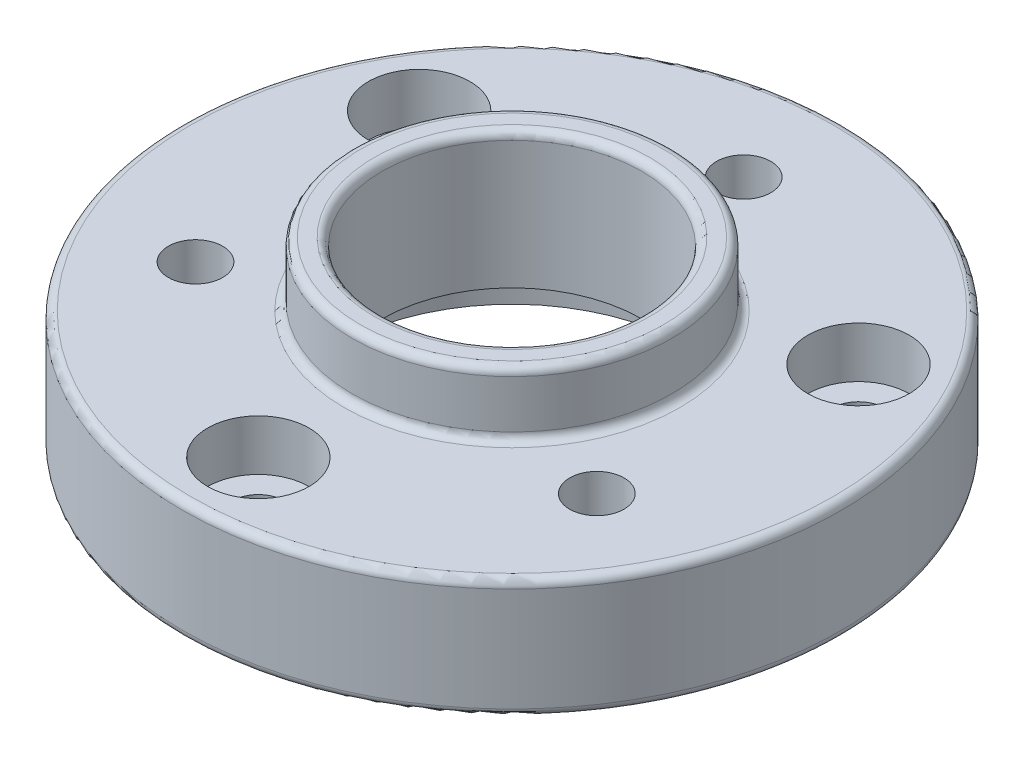
ISO-10303-21;
HEADER;
FILE_DESCRIPTION(('STEP AP214'),'2;1');
FILE_NAME('part.step','',(''),(''),'','','');
FILE_SCHEMA(('AUTOMOTIVE_DESIGN { 1 0 10303 214 1 1 1 1 }'));
ENDSEC;
DATA;
#1=APPLICATION_CONTEXT('core data for automotive mechanical design processes');
#2=APPLICATION_PROTOCOL_DEFINITION('international standard','automotive_design',2000,#1);
#3=PRODUCT_CONTEXT('',#1,'mechanical');
#4=PRODUCT('Part','Part','',(#3));
#5=PRODUCT_RELATED_PRODUCT_CATEGORY('part','',(#4));
#6=PRODUCT_DEFINITION_FORMATION('','',#4);
#7=PRODUCT_DEFINITION_CONTEXT('part definition',#1,'design');
#8=PRODUCT_DEFINITION('design','',#6,#7);
#9=PRODUCT_DEFINITION_SHAPE('','',#8);
#10=(LENGTH_UNIT() NAMED_UNIT(*) SI_UNIT(.MILLI.,.METRE.));
#11=(NAMED_UNIT(*) PLANE_ANGLE_UNIT() SI_UNIT($,.RADIAN.));
#12=(NAMED_UNIT(*) SI_UNIT($,.STERADIAN.) SOLID_ANGLE_UNIT());
#13=UNCERTAINTY_MEASURE_WITH_UNIT(LENGTH_MEASURE(1.E-05),#10,'distance_accuracy_value','');
#14=(GEOMETRIC_REPRESENTATION_CONTEXT(3) GLOBAL_UNCERTAINTY_ASSIGNED_CONTEXT((#13)) GLOBAL_UNIT_ASSIGNED_CONTEXT((#10,
#11,#12)) REPRESENTATION_CONTEXT('',''));
#15=CARTESIAN_POINT('',(0.,0.,0.));
#16=DIRECTION('',(0.,0.,1.));
#17=DIRECTION('',(1.,0.,0.));
#18=AXIS2_PLACEMENT_3D('',#15,#16,#17);
#19=CARTESIAN_POINT('',(0.,23.,0.));
#20=DIRECTION('',(0.,-1.,0.));
#21=DIRECTION('',(0.,0.,-1.));
#22=AXIS2_PLACEMENT_3D('',#19,#20,#21);
#23=CYLINDRICAL_SURFACE('',#22,16.25);
#24=CARTESIAN_POINT('',(0.,22.,0.));
#25=DIRECTION('',(0.,1.,0.));
#26=DIRECTION('',(0.,0.,1.));
#27=AXIS2_PLACEMENT_3D('',#24,#25,#26);
#28=CIRCLE('',#27,16.25);
#29=CARTESIAN_POINT('',(0.,22.,16.25));
#30=VERTEX_POINT('',#29);
#31=EDGE_CURVE('E68',#30,#30,#28,.T.);
#32=ORIENTED_EDGE('',*,*,#31,.T.);
#33=EDGE_LOOP('',(#32));
#34=FACE_BOUND('',#33,.T.);
#35=CARTESIAN_POINT('',(0.,6.,0.));
#36=DIRECTION('',(0.,-1.,0.));
#37=DIRECTION('',(0.,0.,-1.));
#38=AXIS2_PLACEMENT_3D('',#35,#36,#37);
#39=CIRCLE('',#38,16.25);
#40=CARTESIAN_POINT('',(0.,6.,-16.25));
#41=VERTEX_POINT('',#40);
#42=EDGE_CURVE('E92',#41,#41,#39,.T.);
#43=ORIENTED_EDGE('',*,*,#42,.T.);
#44=EDGE_LOOP('',(#43));
#45=FACE_BOUND('',#44,.T.);
#46=ADVANCED_FACE('F45',(#34,#45),#23,.F.);
#47=CARTESIAN_POINT('',(0.,15.,0.));
#48=DIRECTION('',(0.,-1.,0.));
#49=DIRECTION('',(0.,0.,-1.));
#50=AXIS2_PLACEMENT_3D('',#47,#48,#49);
#51=CYLINDRICAL_SURFACE('',#50,41.25);
#52=CARTESIAN_POINT('',(0.,1.,0.));
#53=DIRECTION('',(0.,1.,0.));
#54=DIRECTION('',(0.,0.,1.));
#55=AXIS2_PLACEMENT_3D('',#52,#53,#54);
#56=CIRCLE('',#55,41.25);
#57=CARTESIAN_POINT('',(0.,1.,41.25));
#58=VERTEX_POINT('',#57);
#59=EDGE_CURVE('E52',#58,#58,#56,.T.);
#60=ORIENTED_EDGE('',*,*,#59,.T.);
#61=EDGE_LOOP('',(#60));
#62=FACE_BOUND('',#61,.T.);
#63=CARTESIAN_POINT('',(0.,14.,0.));
#64=DIRECTION('',(0.,1.,0.));
#65=DIRECTION('',(0.,0.,1.));
#66=AXIS2_PLACEMENT_3D('',#63,#64,#65);
#67=CIRCLE('',#66,41.25);
#68=CARTESIAN_POINT('',(0.,14.,41.25));
#69=VERTEX_POINT('',#68);
#70=EDGE_CURVE('E56',#69,#69,#67,.F.);
#71=ORIENTED_EDGE('',*,*,#70,.T.);
#72=EDGE_LOOP('',(#71));
#73=FACE_BOUND('',#72,.T.);
#74=ADVANCED_FACE('F156',(#62,#73),#51,.T.);
#75=CARTESIAN_POINT('',(0.,15.,0.));
#76=DIRECTION('',(0.,1.,0.));
#77=DIRECTION('',(0.,0.,1.));
#78=AXIS2_PLACEMENT_3D('',#75,#76,#77);
#79=PLANE('',#78);
#80=CARTESIAN_POINT('',(0.,15.,-29.));
#81=DIRECTION('',(0.,1.,0.));
#82=DIRECTION('',(0.,0.,1.));
#83=AXIS2_PLACEMENT_3D('',#80,#81,#82);
#84=CIRCLE('',#83,3.39999999999999);
#85=CARTESIAN_POINT('',(0.,15.,-25.6));
#86=VERTEX_POINT('',#85);
#87=EDGE_CURVE('E146',#86,#86,#84,.T.);
#88=ORIENTED_EDGE('',*,*,#87,.F.);
#89=EDGE_LOOP('',(#88));
#90=FACE_BOUND('',#89,.T.);
#91=CARTESIAN_POINT('',(25.1147367097506,15.,14.4999999999989));
#92=DIRECTION('',(0.,1.,0.));
#93=DIRECTION('',(0.,0.,1.));
#94=AXIS2_PLACEMENT_3D('',#91,#92,#93);
#95=CIRCLE('',#94,3.39999999999999);
#96=CARTESIAN_POINT('',(25.1147367097506,15.,17.8999999999989));
#97=VERTEX_POINT('',#96);
#98=EDGE_CURVE('E140',#97,#97,#95,.T.);
#99=ORIENTED_EDGE('',*,*,#98,.F.);
#100=EDGE_LOOP('',(#99));
#101=FACE_BOUND('',#100,.T.);
#102=CARTESIAN_POINT('',(-25.1147367097469,15.,14.5000000000011));
#103=DIRECTION('',(0.,1.,0.));
#104=DIRECTION('',(0.,0.,1.));
#105=AXIS2_PLACEMENT_3D('',#102,#103,#104);
#106=CIRCLE('',#105,3.39999999999999);
#107=CARTESIAN_POINT('',(-25.1147367097469,15.,17.9000000000011));
#108=VERTEX_POINT('',#107);
#109=EDGE_CURVE('E134',#108,#108,#106,.T.);
#110=ORIENTED_EDGE('',*,*,#109,.F.);
#111=EDGE_LOOP('',(#110));
#112=FACE_BOUND('',#111,.T.);
#113=CARTESIAN_POINT('',(0.,15.,0.));
#114=DIRECTION('',(0.,1.,0.));
#115=DIRECTION('',(0.,0.,1.));
#116=AXIS2_PLACEMENT_3D('',#113,#114,#115);
#117=CIRCLE('',#116,21.);
#118=CARTESIAN_POINT('',(0.,15.,21.));
#119=VERTEX_POINT('',#118);
#120=EDGE_CURVE('E71',#119,#119,#117,.F.);
#121=ORIENTED_EDGE('',*,*,#120,.T.);
#122=EDGE_LOOP('',(#121));
#123=FACE_BOUND('',#122,.T.);
#124=CARTESIAN_POINT('',(0.,15.,0.));
#125=DIRECTION('',(0.,1.,0.));
#126=DIRECTION('',(0.,0.,1.));
#127=AXIS2_PLACEMENT_3D('',#124,#125,#126);
#128=CIRCLE('',#127,40.25);
#129=CARTESIAN_POINT('',(0.,15.,40.25));
#130=VERTEX_POINT('',#129);
#131=EDGE_CURVE('E74',#130,#130,#128,.T.);
#132=ORIENTED_EDGE('',*,*,#131,.T.);
#133=EDGE_LOOP('',(#132));
#134=FACE_BOUND('',#133,.T.);
#135=CARTESIAN_POINT('',(0.,15.,31.75));
#136=DIRECTION('',(0.,1.,0.));
#137=DIRECTION('',(0.,0.,1.));
#138=AXIS2_PLACEMENT_3D('',#135,#136,#137);
#139=CIRCLE('',#138,6.35);
#140=CARTESIAN_POINT('',(0.,15.,38.1));
#141=VERTEX_POINT('',#140);
#142=EDGE_CURVE('E128',#141,#141,#139,.T.);
#143=ORIENTED_EDGE('',*,*,#142,.F.);
#144=EDGE_LOOP('',(#143));
#145=FACE_BOUND('',#144,.T.);
#146=CARTESIAN_POINT('',(-27.4963065701559,15.,-15.875));
#147=DIRECTION('',(0.,1.,0.));
#148=DIRECTION('',(0.,0.,1.));
#149=AXIS2_PLACEMENT_3D('',#146,#147,#148);
#150=CIRCLE('',#149,6.35);
#151=CARTESIAN_POINT('',(-27.4963065701559,15.,-9.525));
#152=VERTEX_POINT('',#151);
#153=EDGE_CURVE('E116',#152,#152,#150,.T.);
#154=ORIENTED_EDGE('',*,*,#153,.F.);
#155=EDGE_LOOP('',(#154));
#156=FACE_BOUND('',#155,.T.);
#157=CARTESIAN_POINT('',(27.4963065701559,15.,-15.875));
#158=DIRECTION('',(0.,1.,0.));
#159=DIRECTION('',(0.,0.,1.));
#160=AXIS2_PLACEMENT_3D('',#157,#158,#159);
#161=CIRCLE('',#160,6.35);
#162=CARTESIAN_POINT('',(27.4963065701559,15.,-9.525));
#163=VERTEX_POINT('',#162);
#164=EDGE_CURVE('E104',#163,#163,#161,.T.);
#165=ORIENTED_EDGE('',*,*,#164,.F.);
#166=EDGE_LOOP('',(#165));
#167=FACE_BOUND('',#166,.T.);
#168=ADVANCED_FACE('F152',(#90,#101,#112,#123,#134,#145,#156,#167),#79,.T.);
#169=CARTESIAN_POINT('',(0.,0.,0.));
#170=DIRECTION('',(0.,1.,0.));
#171=DIRECTION('',(0.,0.,1.));
#172=AXIS2_PLACEMENT_3D('',#169,#170,#171);
#173=PLANE('',#172);
#174=CARTESIAN_POINT('',(0.,0.,-29.));
#175=DIRECTION('',(0.,1.,0.));
#176=DIRECTION('',(0.,0.,1.));
#177=AXIS2_PLACEMENT_3D('',#174,#175,#176);
#178=CIRCLE('',#177,3.4);
#179=CARTESIAN_POINT('',(0.,0.,-25.6));
#180=VERTEX_POINT('',#179);
#181=EDGE_CURVE('E143',#180,#180,#178,.T.);
#182=ORIENTED_EDGE('',*,*,#181,.T.);
#183=EDGE_LOOP('',(#182));
#184=FACE_BOUND('',#183,.T.);
#185=CARTESIAN_POINT('',(25.1147367097506,0.,14.4999999999989));
#186=DIRECTION('',(0.,1.,0.));
#187=DIRECTION('',(0.,0.,1.));
#188=AXIS2_PLACEMENT_3D('',#185,#186,#187);
#189=CIRCLE('',#188,3.4);
#190=CARTESIAN_POINT('',(25.1147367097506,0.,17.8999999999989));
#191=VERTEX_POINT('',#190);
#192=EDGE_CURVE('E137',#191,#191,#189,.T.);
#193=ORIENTED_EDGE('',*,*,#192,.T.);
#194=EDGE_LOOP('',(#193));
#195=FACE_BOUND('',#194,.T.);
#196=CARTESIAN_POINT('',(-25.1147367097469,0.,14.5000000000011));
#197=DIRECTION('',(0.,1.,0.));
#198=DIRECTION('',(0.,0.,1.));
#199=AXIS2_PLACEMENT_3D('',#196,#197,#198);
#200=CIRCLE('',#199,3.4);
#201=CARTESIAN_POINT('',(-25.1147367097469,0.,17.9000000000011));
#202=VERTEX_POINT('',#201);
#203=EDGE_CURVE('E131',#202,#202,#200,.T.);
#204=ORIENTED_EDGE('',*,*,#203,.T.);
#205=EDGE_LOOP('',(#204));
#206=FACE_BOUND('',#205,.T.);
#207=CARTESIAN_POINT('',(0.,0.,0.));
#208=DIRECTION('',(0.,1.,0.));
#209=DIRECTION('',(0.,0.,1.));
#210=AXIS2_PLACEMENT_3D('',#207,#208,#209);
#211=CIRCLE('',#210,40.25);
#212=CARTESIAN_POINT('',(0.,0.,40.25));
#213=VERTEX_POINT('',#212);
#214=EDGE_CURVE('E10',#213,#213,#211,.F.);
#215=ORIENTED_EDGE('',*,*,#214,.T.);
#216=EDGE_LOOP('',(#215));
#217=FACE_BOUND('',#216,.T.);
#218=CARTESIAN_POINT('',(0.,0.,31.75));
#219=DIRECTION('',(0.,1.,0.));
#220=DIRECTION('',(0.,0.,1.));
#221=AXIS2_PLACEMENT_3D('',#218,#219,#220);
#222=CIRCLE('',#221,3.2639);
#223=CARTESIAN_POINT('',(0.,0.,35.0139));
#224=VERTEX_POINT('',#223);
#225=EDGE_CURVE('E119',#224,#224,#222,.T.);
#226=ORIENTED_EDGE('',*,*,#225,.T.);
#227=EDGE_LOOP('',(#226));
#228=FACE_BOUND('',#227,.T.);
#229=CARTESIAN_POINT('',(-27.4963065701559,0.,-15.875));
#230=DIRECTION('',(0.,1.,0.));
#231=DIRECTION('',(0.,0.,1.));
#232=AXIS2_PLACEMENT_3D('',#229,#230,#231);
#233=CIRCLE('',#232,3.2639);
#234=CARTESIAN_POINT('',(-27.4963065701559,0.,-12.6111));
#235=VERTEX_POINT('',#234);
#236=EDGE_CURVE('E107',#235,#235,#233,.T.);
#237=ORIENTED_EDGE('',*,*,#236,.T.);
#238=EDGE_LOOP('',(#237));
#239=FACE_BOUND('',#238,.T.);
#240=CARTESIAN_POINT('',(27.4963065701559,0.,-15.875));
#241=DIRECTION('',(0.,1.,0.));
#242=DIRECTION('',(0.,0.,1.));
#243=AXIS2_PLACEMENT_3D('',#240,#241,#242);
#244=CIRCLE('',#243,3.2639);
#245=CARTESIAN_POINT('',(27.4963065701559,0.,-12.6111));
#246=VERTEX_POINT('',#245);
#247=EDGE_CURVE('E95',#246,#246,#244,.T.);
#248=ORIENTED_EDGE('',*,*,#247,.T.);
#249=EDGE_LOOP('',(#248));
#250=FACE_BOUND('',#249,.T.);
#251=CARTESIAN_POINT('',(0.,0.,0.));
#252=DIRECTION('',(0.,-1.,0.));
#253=DIRECTION('',(0.,0.,-1.));
#254=AXIS2_PLACEMENT_3D('',#251,#252,#253);
#255=CIRCLE('',#254,22.225);
#256=CARTESIAN_POINT('',(0.,0.,-22.225));
#257=VERTEX_POINT('',#256);
#258=EDGE_CURVE('E89',#257,#257,#255,.T.);
#259=ORIENTED_EDGE('',*,*,#258,.F.);
#260=EDGE_LOOP('',(#259));
#261=FACE_BOUND('',#260,.T.);
#262=ADVANCED_FACE('F155',(#184,#195,#206,#217,#228,#239,#250,#261),#173,.F.);
#263=CARTESIAN_POINT('',(0.,23.,0.));
#264=DIRECTION('',(0.,1.,0.));
#265=DIRECTION('',(0.,0.,1.));
#266=AXIS2_PLACEMENT_3D('',#263,#264,#265);
#267=PLANE('',#266);
#268=CARTESIAN_POINT('',(0.,23.,0.));
#269=DIRECTION('',(0.,1.,0.));
#270=DIRECTION('',(0.,0.,1.));
#271=AXIS2_PLACEMENT_3D('',#268,#269,#270);
#272=CIRCLE('',#271,17.25);
#273=CARTESIAN_POINT('',(0.,23.,17.25));
#274=VERTEX_POINT('',#273);
#275=EDGE_CURVE('E60',#274,#274,#272,.F.);
#276=ORIENTED_EDGE('',*,*,#275,.T.);
#277=EDGE_LOOP('',(#276));
#278=FACE_BOUND('',#277,.T.);
#279=CARTESIAN_POINT('',(0.,23.,0.));
#280=DIRECTION('',(0.,1.,0.));
#281=DIRECTION('',(0.,0.,1.));
#282=AXIS2_PLACEMENT_3D('',#279,#280,#281);
#283=CIRCLE('',#282,19.);
#284=CARTESIAN_POINT('',(0.,23.,19.));
#285=VERTEX_POINT('',#284);
#286=EDGE_CURVE('E65',#285,#285,#283,.T.);
#287=ORIENTED_EDGE('',*,*,#286,.T.);
#288=EDGE_LOOP('',(#287));
#289=FACE_BOUND('',#288,.T.);
#290=ADVANCED_FACE('F202',(#278,#289),#267,.T.);
#291=CARTESIAN_POINT('',(0.,23.,0.));
#292=DIRECTION('',(0.,-1.,0.));
#293=DIRECTION('',(0.,0.,-1.));
#294=AXIS2_PLACEMENT_3D('',#291,#292,#293);
#295=CYLINDRICAL_SURFACE('',#294,20.);
#296=CARTESIAN_POINT('',(0.,16.,0.));
#297=DIRECTION('',(0.,1.,0.));
#298=DIRECTION('',(0.,0.,1.));
#299=AXIS2_PLACEMENT_3D('',#296,#297,#298);
#300=CIRCLE('',#299,20.);
#301=CARTESIAN_POINT('',(0.,16.,20.));
#302=VERTEX_POINT('',#301);
#303=EDGE_CURVE('E77',#302,#302,#300,.T.);
#304=ORIENTED_EDGE('',*,*,#303,.T.);
#305=EDGE_LOOP('',(#304));
#306=FACE_BOUND('',#305,.T.);
#307=CARTESIAN_POINT('',(0.,22.,0.));
#308=DIRECTION('',(0.,1.,0.));
#309=DIRECTION('',(0.,0.,1.));
#310=AXIS2_PLACEMENT_3D('',#307,#308,#309);
#311=CIRCLE('',#310,20.);
#312=CARTESIAN_POINT('',(0.,22.,20.));
#313=VERTEX_POINT('',#312);
#314=EDGE_CURVE('E80',#313,#313,#311,.F.);
#315=ORIENTED_EDGE('',*,*,#314,.T.);
#316=EDGE_LOOP('',(#315));
#317=FACE_BOUND('',#316,.T.);
#318=ADVANCED_FACE('F205',(#306,#317),#295,.T.);
#319=CARTESIAN_POINT('',(0.,6.,0.));
#320=DIRECTION('',(0.,-1.,0.));
#321=DIRECTION('',(0.,0.,-1.));
#322=AXIS2_PLACEMENT_3D('',#319,#320,#321);
#323=CYLINDRICAL_SURFACE('',#322,22.225);
#324=CARTESIAN_POINT('',(0.,5.,0.));
#325=DIRECTION('',(0.,-1.,0.));
#326=DIRECTION('',(0.,0.,-1.));
#327=AXIS2_PLACEMENT_3D('',#324,#325,#326);
#328=CIRCLE('',#327,22.225);
#329=CARTESIAN_POINT('',(0.,5.,-22.225));
#330=VERTEX_POINT('',#329);
#331=EDGE_CURVE('E83',#330,#330,#328,.F.);
#332=ORIENTED_EDGE('',*,*,#331,.T.);
#333=EDGE_LOOP('',(#332));
#334=FACE_BOUND('',#333,.T.);
#335=ORIENTED_EDGE('',*,*,#258,.T.);
#336=EDGE_LOOP('',(#335));
#337=FACE_BOUND('',#336,.T.);
#338=ADVANCED_FACE('F200',(#334,#337),#323,.F.);
#339=CARTESIAN_POINT('',(0.,6.,0.));
#340=DIRECTION('',(0.,-1.,0.));
#341=DIRECTION('',(0.,0.,-1.));
#342=AXIS2_PLACEMENT_3D('',#339,#340,#341);
#343=PLANE('',#342);
#344=CARTESIAN_POINT('',(0.,6.,0.));
#345=DIRECTION('',(0.,-1.,0.));
#346=DIRECTION('',(0.,0.,-1.));
#347=AXIS2_PLACEMENT_3D('',#344,#345,#346);
#348=CIRCLE('',#347,21.225);
#349=CARTESIAN_POINT('',(0.,6.,-21.225));
#350=VERTEX_POINT('',#349);
#351=EDGE_CURVE('E86',#350,#350,#348,.T.);
#352=ORIENTED_EDGE('',*,*,#351,.T.);
#353=EDGE_LOOP('',(#352));
#354=FACE_BOUND('',#353,.T.);
#355=ORIENTED_EDGE('',*,*,#42,.F.);
#356=EDGE_LOOP('',(#355));
#357=FACE_BOUND('',#356,.T.);
#358=ADVANCED_FACE('F419',(#354,#357),#343,.T.);
#359=CARTESIAN_POINT('',(27.4963065701559,15.,-15.875));
#360=DIRECTION('',(0.,1.,0.));
#361=DIRECTION('',(0.,0.,1.));
#362=AXIS2_PLACEMENT_3D('',#359,#360,#361);
#363=CYLINDRICAL_SURFACE('',#362,3.2639);
#364=ORIENTED_EDGE('',*,*,#247,.F.);
#365=EDGE_LOOP('',(#364));
#366=FACE_BOUND('',#365,.T.);
#367=CARTESIAN_POINT('',(27.4963065701559,8.65,-15.875));
#368=DIRECTION('',(0.,1.,0.));
#369=DIRECTION('',(0.,0.,1.));
#370=AXIS2_PLACEMENT_3D('',#367,#368,#369);
#371=CIRCLE('',#370,3.2639);
#372=CARTESIAN_POINT('',(27.4963065701559,8.65,-12.6111));
#373=VERTEX_POINT('',#372);
#374=EDGE_CURVE('E98',#373,#373,#371,.T.);
#375=ORIENTED_EDGE('',*,*,#374,.T.);
#376=EDGE_LOOP('',(#375));
#377=FACE_BOUND('',#376,.T.);
#378=ADVANCED_FACE('F185',(#366,#377),#363,.F.);
#379=CARTESIAN_POINT('',(30.7602065701559,8.65,-15.875));
#380=DIRECTION('',(0.,-1.,0.));
#381=DIRECTION('',(0.,0.,-1.));
#382=AXIS2_PLACEMENT_3D('',#379,#380,#381);
#383=PLANE('',#382);
#384=ORIENTED_EDGE('',*,*,#374,.F.);
#385=EDGE_LOOP('',(#384));
#386=FACE_BOUND('',#385,.T.);
#387=CARTESIAN_POINT('',(27.4963065701559,8.65,-15.875));
#388=DIRECTION('',(0.,1.,0.));
#389=DIRECTION('',(0.,0.,1.));
#390=AXIS2_PLACEMENT_3D('',#387,#388,#389);
#391=CIRCLE('',#390,6.35);
#392=CARTESIAN_POINT('',(27.4963065701559,8.65,-9.525));
#393=VERTEX_POINT('',#392);
#394=EDGE_CURVE('E101',#393,#393,#391,.T.);
#395=ORIENTED_EDGE('',*,*,#394,.T.);
#396=EDGE_LOOP('',(#395));
#397=FACE_BOUND('',#396,.T.);
#398=ADVANCED_FACE('F175',(#386,#397),#383,.F.);
#399=CARTESIAN_POINT('',(27.4963065701559,15.,-15.875));
#400=DIRECTION('',(0.,1.,0.));
#401=DIRECTION('',(0.,0.,1.));
#402=AXIS2_PLACEMENT_3D('',#399,#400,#401);
#403=CYLINDRICAL_SURFACE('',#402,6.35);
#404=ORIENTED_EDGE('',*,*,#394,.F.);
#405=EDGE_LOOP('',(#404));
#406=FACE_BOUND('',#405,.T.);
#407=ORIENTED_EDGE('',*,*,#164,.T.);
#408=EDGE_LOOP('',(#407));
#409=FACE_BOUND('',#408,.T.);
#410=ADVANCED_FACE('F172',(#406,#409),#403,.F.);
#411=CARTESIAN_POINT('',(-27.4963065701559,15.,-15.875));
#412=DIRECTION('',(0.,1.,0.));
#413=DIRECTION('',(0.,0.,1.));
#414=AXIS2_PLACEMENT_3D('',#411,#412,#413);
#415=CYLINDRICAL_SURFACE('',#414,3.2639);
#416=ORIENTED_EDGE('',*,*,#236,.F.);
#417=EDGE_LOOP('',(#416));
#418=FACE_BOUND('',#417,.T.);
#419=CARTESIAN_POINT('',(-27.4963065701559,8.65,-15.875));
#420=DIRECTION('',(0.,1.,0.));
#421=DIRECTION('',(0.,0.,1.));
#422=AXIS2_PLACEMENT_3D('',#419,#420,#421);
#423=CIRCLE('',#422,3.2639);
#424=CARTESIAN_POINT('',(-27.4963065701559,8.65,-12.6111));
#425=VERTEX_POINT('',#424);
#426=EDGE_CURVE('E110',#425,#425,#423,.T.);
#427=ORIENTED_EDGE('',*,*,#426,.T.);
#428=EDGE_LOOP('',(#427));
#429=FACE_BOUND('',#428,.T.);
#430=ADVANCED_FACE('F174',(#418,#429),#415,.F.);
#431=CARTESIAN_POINT('',(-24.2324065701559,8.65,-15.875));
#432=DIRECTION('',(0.,-1.,0.));
#433=DIRECTION('',(0.,0.,-1.));
#434=AXIS2_PLACEMENT_3D('',#431,#432,#433);
#435=PLANE('',#434);
#436=ORIENTED_EDGE('',*,*,#426,.F.);
#437=EDGE_LOOP('',(#436));
#438=FACE_BOUND('',#437,.T.);
#439=CARTESIAN_POINT('',(-27.4963065701559,8.65,-15.875));
#440=DIRECTION('',(0.,1.,0.));
#441=DIRECTION('',(0.,0.,1.));
#442=AXIS2_PLACEMENT_3D('',#439,#440,#441);
#443=CIRCLE('',#442,6.35);
#444=CARTESIAN_POINT('',(-27.4963065701559,8.65,-9.525));
#445=VERTEX_POINT('',#444);
#446=EDGE_CURVE('E113',#445,#445,#443,.T.);
#447=ORIENTED_EDGE('',*,*,#446,.T.);
#448=EDGE_LOOP('',(#447));
#449=FACE_BOUND('',#448,.T.);
#450=ADVANCED_FACE('F182',(#438,#449),#435,.F.);
#451=CARTESIAN_POINT('',(-27.4963065701559,15.,-15.875));
#452=DIRECTION('',(0.,1.,0.));
#453=DIRECTION('',(0.,0.,1.));
#454=AXIS2_PLACEMENT_3D('',#451,#452,#453);
#455=CYLINDRICAL_SURFACE('',#454,6.35);
#456=ORIENTED_EDGE('',*,*,#446,.F.);
#457=EDGE_LOOP('',(#456));
#458=FACE_BOUND('',#457,.T.);
#459=ORIENTED_EDGE('',*,*,#153,.T.);
#460=EDGE_LOOP('',(#459));
#461=FACE_BOUND('',#460,.T.);
#462=ADVANCED_FACE('F266',(#458,#461),#455,.F.);
#463=CARTESIAN_POINT('',(0.,15.,31.75));
#464=DIRECTION('',(0.,1.,0.));
#465=DIRECTION('',(0.,0.,1.));
#466=AXIS2_PLACEMENT_3D('',#463,#464,#465);
#467=CYLINDRICAL_SURFACE('',#466,3.2639);
#468=ORIENTED_EDGE('',*,*,#225,.F.);
#469=EDGE_LOOP('',(#468));
#470=FACE_BOUND('',#469,.T.);
#471=CARTESIAN_POINT('',(0.,8.65,31.75));
#472=DIRECTION('',(0.,1.,0.));
#473=DIRECTION('',(0.,0.,1.));
#474=AXIS2_PLACEMENT_3D('',#471,#472,#473);
#475=CIRCLE('',#474,3.2639);
#476=CARTESIAN_POINT('',(0.,8.65,35.0139));
#477=VERTEX_POINT('',#476);
#478=EDGE_CURVE('E122',#477,#477,#475,.T.);
#479=ORIENTED_EDGE('',*,*,#478,.T.);
#480=EDGE_LOOP('',(#479));
#481=FACE_BOUND('',#480,.T.);
#482=ADVANCED_FACE('F262',(#470,#481),#467,.F.);
#483=CARTESIAN_POINT('',(3.2639,8.65,31.75));
#484=DIRECTION('',(0.,-1.,0.));
#485=DIRECTION('',(0.,0.,-1.));
#486=AXIS2_PLACEMENT_3D('',#483,#484,#485);
#487=PLANE('',#486);
#488=ORIENTED_EDGE('',*,*,#478,.F.);
#489=EDGE_LOOP('',(#488));
#490=FACE_BOUND('',#489,.T.);
#491=CARTESIAN_POINT('',(0.,8.65,31.75));
#492=DIRECTION('',(0.,1.,0.));
#493=DIRECTION('',(0.,0.,1.));
#494=AXIS2_PLACEMENT_3D('',#491,#492,#493);
#495=CIRCLE('',#494,6.35);
#496=CARTESIAN_POINT('',(0.,8.65,38.1));
#497=VERTEX_POINT('',#496);
#498=EDGE_CURVE('E125',#497,#497,#495,.T.);
#499=ORIENTED_EDGE('',*,*,#498,.T.);
#500=EDGE_LOOP('',(#499));
#501=FACE_BOUND('',#500,.T.);
#502=ADVANCED_FACE('F258',(#490,#501),#487,.F.);
#503=CARTESIAN_POINT('',(0.,15.,31.75));
#504=DIRECTION('',(0.,1.,0.));
#505=DIRECTION('',(0.,0.,1.));
#506=AXIS2_PLACEMENT_3D('',#503,#504,#505);
#507=CYLINDRICAL_SURFACE('',#506,6.35);
#508=ORIENTED_EDGE('',*,*,#498,.F.);
#509=EDGE_LOOP('',(#508));
#510=FACE_BOUND('',#509,.T.);
#511=ORIENTED_EDGE('',*,*,#142,.T.);
#512=EDGE_LOOP('',(#511));
#513=FACE_BOUND('',#512,.T.);
#514=ADVANCED_FACE('F217',(#510,#513),#507,.F.);
#515=CARTESIAN_POINT('',(0.,5.,0.));
#516=DIRECTION('',(0.,-1.,0.));
#517=DIRECTION('',(0.,0.,-1.));
#518=AXIS2_PLACEMENT_3D('',#515,#516,#517);
#519=TOROIDAL_SURFACE('',#518,21.225,1.);
#520=ORIENTED_EDGE('',*,*,#331,.F.);
#521=EDGE_LOOP('',(#520));
#522=FACE_BOUND('',#521,.T.);
#523=ORIENTED_EDGE('',*,*,#351,.F.);
#524=EDGE_LOOP('',(#523));
#525=FACE_BOUND('',#524,.T.);
#526=ADVANCED_FACE('F213',(#522,#525),#519,.F.);
#527=CARTESIAN_POINT('',(0.,16.,0.));
#528=DIRECTION('',(0.,1.,0.));
#529=DIRECTION('',(0.,0.,1.));
#530=AXIS2_PLACEMENT_3D('',#527,#528,#529);
#531=TOROIDAL_SURFACE('',#530,21.,1.);
#532=ORIENTED_EDGE('',*,*,#120,.F.);
#533=EDGE_LOOP('',(#532));
#534=FACE_BOUND('',#533,.T.);
#535=ORIENTED_EDGE('',*,*,#303,.F.);
#536=EDGE_LOOP('',(#535));
#537=FACE_BOUND('',#536,.T.);
#538=ADVANCED_FACE('F216',(#534,#537),#531,.F.);
#539=CARTESIAN_POINT('',(0.,22.,0.));
#540=DIRECTION('',(0.,1.,0.));
#541=DIRECTION('',(0.,0.,1.));
#542=AXIS2_PLACEMENT_3D('',#539,#540,#541);
#543=TOROIDAL_SURFACE('',#542,17.25,1.);
#544=ORIENTED_EDGE('',*,*,#275,.F.);
#545=EDGE_LOOP('',(#544));
#546=FACE_BOUND('',#545,.T.);
#547=ORIENTED_EDGE('',*,*,#31,.F.);
#548=EDGE_LOOP('',(#547));
#549=FACE_BOUND('',#548,.T.);
#550=ADVANCED_FACE('F221',(#546,#549),#543,.T.);
#551=CARTESIAN_POINT('',(0.,22.,0.));
#552=DIRECTION('',(0.,1.,0.));
#553=DIRECTION('',(0.,0.,1.));
#554=AXIS2_PLACEMENT_3D('',#551,#552,#553);
#555=TOROIDAL_SURFACE('',#554,19.,1.);
#556=ORIENTED_EDGE('',*,*,#314,.F.);
#557=EDGE_LOOP('',(#556));
#558=FACE_BOUND('',#557,.T.);
#559=ORIENTED_EDGE('',*,*,#286,.F.);
#560=EDGE_LOOP('',(#559));
#561=FACE_BOUND('',#560,.T.);
#562=ADVANCED_FACE('F225',(#558,#561),#555,.T.);
#563=CARTESIAN_POINT('',(0.,1.,0.));
#564=DIRECTION('',(0.,1.,0.));
#565=DIRECTION('',(0.,0.,1.));
#566=AXIS2_PLACEMENT_3D('',#563,#564,#565);
#567=TOROIDAL_SURFACE('',#566,40.25,1.);
#568=ORIENTED_EDGE('',*,*,#214,.F.);
#569=EDGE_LOOP('',(#568));
#570=FACE_BOUND('',#569,.T.);
#571=ORIENTED_EDGE('',*,*,#59,.F.);
#572=EDGE_LOOP('',(#571));
#573=FACE_BOUND('',#572,.T.);
#574=ADVANCED_FACE('F228',(#570,#573),#567,.T.);
#575=CARTESIAN_POINT('',(0.,14.,0.));
#576=DIRECTION('',(0.,1.,0.));
#577=DIRECTION('',(0.,0.,1.));
#578=AXIS2_PLACEMENT_3D('',#575,#576,#577);
#579=TOROIDAL_SURFACE('',#578,40.25,1.);
#580=ORIENTED_EDGE('',*,*,#70,.F.);
#581=EDGE_LOOP('',(#580));
#582=FACE_BOUND('',#581,.T.);
#583=ORIENTED_EDGE('',*,*,#131,.F.);
#584=EDGE_LOOP('',(#583));
#585=FACE_BOUND('',#584,.T.);
#586=ADVANCED_FACE('F47',(#582,#585),#579,.T.);
#587=CARTESIAN_POINT('',(-25.1147367097469,15.,14.5000000000011));
#588=DIRECTION('',(0.,1.,0.));
#589=DIRECTION('',(0.,0.,1.));
#590=AXIS2_PLACEMENT_3D('',#587,#588,#589);
#591=CYLINDRICAL_SURFACE('',#590,3.39999999999999);
#592=ORIENTED_EDGE('',*,*,#203,.F.);
#593=EDGE_LOOP('',(#592));
#594=FACE_BOUND('',#593,.T.);
#595=ORIENTED_EDGE('',*,*,#109,.T.);
#596=EDGE_LOOP('',(#595));
#597=FACE_BOUND('',#596,.T.);
#598=ADVANCED_FACE('F235',(#594,#597),#591,.F.);
#599=CARTESIAN_POINT('',(25.1147367097506,15.,14.4999999999989));
#600=DIRECTION('',(0.,1.,0.));
#601=DIRECTION('',(0.,0.,1.));
#602=AXIS2_PLACEMENT_3D('',#599,#600,#601);
#603=CYLINDRICAL_SURFACE('',#602,3.39999999999999);
#604=ORIENTED_EDGE('',*,*,#192,.F.);
#605=EDGE_LOOP('',(#604));
#606=FACE_BOUND('',#605,.T.);
#607=ORIENTED_EDGE('',*,*,#98,.T.);
#608=EDGE_LOOP('',(#607));
#609=FACE_BOUND('',#608,.T.);
#610=ADVANCED_FACE('F242',(#606,#609),#603,.F.);
#611=CARTESIAN_POINT('',(0.,15.,-29.));
#612=DIRECTION('',(0.,1.,0.));
#613=DIRECTION('',(0.,0.,1.));
#614=AXIS2_PLACEMENT_3D('',#611,#612,#613);
#615=CYLINDRICAL_SURFACE('',#614,3.39999999999999);
#616=ORIENTED_EDGE('',*,*,#181,.F.);
#617=EDGE_LOOP('',(#616));
#618=FACE_BOUND('',#617,.T.);
#619=ORIENTED_EDGE('',*,*,#87,.T.);
#620=EDGE_LOOP('',(#619));
#621=FACE_BOUND('',#620,.T.);
#622=ADVANCED_FACE('F150',(#618,#621),#615,.F.);
#623=CLOSED_SHELL('',(#46,#74,#168,#262,#290,#318,#338,#358,#378,#398,#410,#430,#450,#462,#482,
#502,#514,#526,#538,#550,#562,#574,#586,#598,#610,#622));
#624=MANIFOLD_SOLID_BREP('B2',#623);
#625=ADVANCED_BREP_SHAPE_REPRESENTATION('',(#18,#624),#14);
#626=SHAPE_DEFINITION_REPRESENTATION(#9,#625);
ENDSEC;
END-ISO-10303-21;
